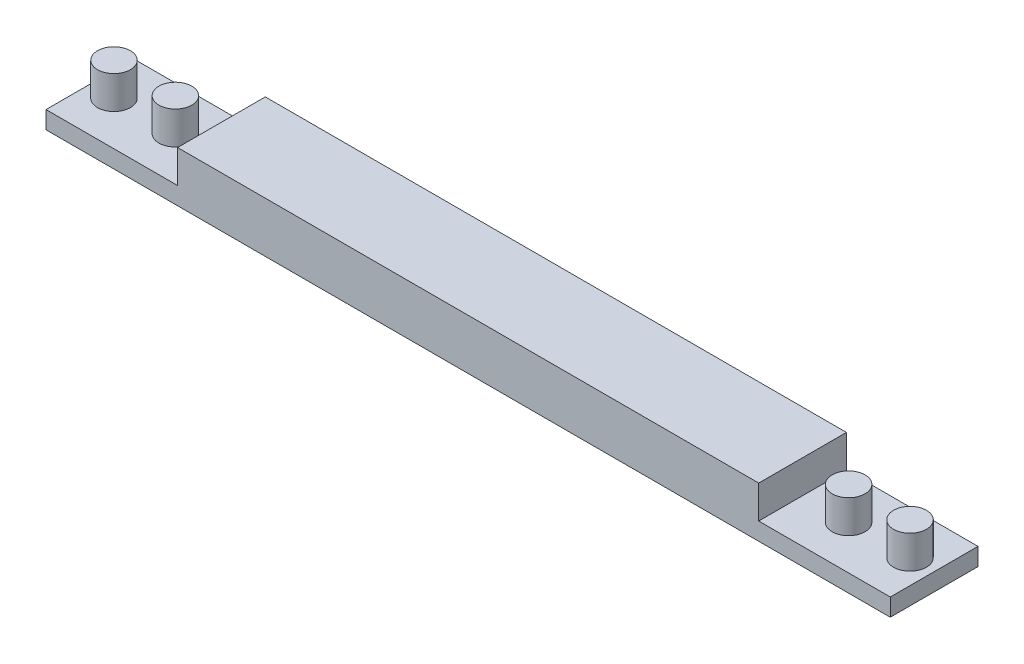
ISO-10303-21;
HEADER;
FILE_DESCRIPTION(('STEP AP214'),'2;1');
FILE_NAME('part.step','',(''),(''),'','','');
FILE_SCHEMA(('AUTOMOTIVE_DESIGN { 1 0 10303 214 1 1 1 1 }'));
ENDSEC;
DATA;
#1=APPLICATION_CONTEXT('core data for automotive mechanical design processes');
#2=APPLICATION_PROTOCOL_DEFINITION('international standard','automotive_design',2000,#1);
#3=PRODUCT_CONTEXT('',#1,'mechanical');
#4=PRODUCT('Part','Part','',(#3));
#5=PRODUCT_RELATED_PRODUCT_CATEGORY('part','',(#4));
#6=PRODUCT_DEFINITION_FORMATION('','',#4);
#7=PRODUCT_DEFINITION_CONTEXT('part definition',#1,'design');
#8=PRODUCT_DEFINITION('design','',#6,#7);
#9=PRODUCT_DEFINITION_SHAPE('','',#8);
#10=(LENGTH_UNIT() NAMED_UNIT(*) SI_UNIT(.MILLI.,.METRE.));
#11=(NAMED_UNIT(*) PLANE_ANGLE_UNIT() SI_UNIT($,.RADIAN.));
#12=(NAMED_UNIT(*) SI_UNIT($,.STERADIAN.) SOLID_ANGLE_UNIT());
#13=UNCERTAINTY_MEASURE_WITH_UNIT(LENGTH_MEASURE(1.E-05),#10,'distance_accuracy_value','');
#14=(GEOMETRIC_REPRESENTATION_CONTEXT(3) GLOBAL_UNCERTAINTY_ASSIGNED_CONTEXT((#13)) GLOBAL_UNIT_ASSIGNED_CONTEXT((#10,
#11,#12)) REPRESENTATION_CONTEXT('',''));
#15=CARTESIAN_POINT('',(0.,0.,0.));
#16=DIRECTION('',(0.,0.,1.));
#17=DIRECTION('',(1.,0.,0.));
#18=AXIS2_PLACEMENT_3D('',#15,#16,#17);
#19=CARTESIAN_POINT('',(0.,0.8,0.));
#20=DIRECTION('',(0.,1.,0.));
#21=DIRECTION('',(0.,0.,1.));
#22=AXIS2_PLACEMENT_3D('',#19,#20,#21);
#23=PLANE('',#22);
#24=CARTESIAN_POINT('',(15.35,0.8,0.));
#25=DIRECTION('',(0.,1.,0.));
#26=DIRECTION('',(0.,0.,-1.));
#27=AXIS2_PLACEMENT_3D('',#24,#25,#26);
#28=CIRCLE('',#27,0.750000000000002);
#29=CARTESIAN_POINT('',(15.35,0.8,-0.750000000000024));
#30=VERTEX_POINT('',#29);
#31=EDGE_CURVE('E203',#30,#30,#28,.T.);
#32=ORIENTED_EDGE('',*,*,#31,.F.);
#33=EDGE_LOOP('',(#32));
#34=FACE_BOUND('',#33,.T.);
#35=CARTESIAN_POINT('',(18.15,0.8,0.));
#36=DIRECTION('',(0.,1.,0.));
#37=DIRECTION('',(0.,0.,-1.));
#38=AXIS2_PLACEMENT_3D('',#35,#36,#37);
#39=CIRCLE('',#38,0.750000000000002);
#40=CARTESIAN_POINT('',(18.15,0.8,-0.750000000000005));
#41=VERTEX_POINT('',#40);
#42=EDGE_CURVE('E206',#41,#41,#39,.T.);
#43=ORIENTED_EDGE('',*,*,#42,.F.);
#44=EDGE_LOOP('',(#43));
#45=FACE_BOUND('',#44,.T.);
#46=DIRECTION('',(1.,0.,0.));
#47=VECTOR('',#46,1.);
#48=CARTESIAN_POINT('',(0.,0.8,-2.));
#49=LINE('',#48,#47);
#50=CARTESIAN_POINT('',(13.25,0.8,-2.));
#51=VERTEX_POINT('',#50);
#52=CARTESIAN_POINT('',(19.25,0.8,-2.));
#53=VERTEX_POINT('',#52);
#54=EDGE_CURVE('E150',#51,#53,#49,.T.);
#55=ORIENTED_EDGE('',*,*,#54,.F.);
#56=DIRECTION('',(0.,0.,1.));
#57=VECTOR('',#56,1.);
#58=CARTESIAN_POINT('',(13.25,0.8,0.));
#59=LINE('',#58,#57);
#60=CARTESIAN_POINT('',(13.25,0.8,2.));
#61=VERTEX_POINT('',#60);
#62=EDGE_CURVE('E122',#51,#61,#59,.T.);
#63=ORIENTED_EDGE('',*,*,#62,.T.);
#64=DIRECTION('',(1.,0.,0.));
#65=VECTOR('',#64,1.);
#66=CARTESIAN_POINT('',(0.,0.8,2.));
#67=LINE('',#66,#65);
#68=CARTESIAN_POINT('',(19.25,0.8,2.));
#69=VERTEX_POINT('',#68);
#70=EDGE_CURVE('E87',#61,#69,#67,.T.);
#71=ORIENTED_EDGE('',*,*,#70,.T.);
#72=DIRECTION('',(0.,0.,-1.));
#73=VECTOR('',#72,1.);
#74=CARTESIAN_POINT('',(19.25,0.8,0.));
#75=LINE('',#74,#73);
#76=EDGE_CURVE('E148',#69,#53,#75,.T.);
#77=ORIENTED_EDGE('',*,*,#76,.T.);
#78=EDGE_LOOP('',(#55,#63,#71,#77));
#79=FACE_BOUND('',#78,.T.);
#80=ADVANCED_FACE('F37',(#34,#45,#79),#23,.T.);
#81=CARTESIAN_POINT('',(0.,0.8,2.));
#82=DIRECTION('',(0.,0.,-1.));
#83=DIRECTION('',(-1.,0.,0.));
#84=AXIS2_PLACEMENT_3D('',#81,#82,#83);
#85=PLANE('',#84);
#86=DIRECTION('',(1.,0.,0.));
#87=VECTOR('',#86,1.);
#88=CARTESIAN_POINT('',(0.,0.,2.));
#89=LINE('',#88,#87);
#90=CARTESIAN_POINT('',(-19.25,0.,2.));
#91=VERTEX_POINT('',#90);
#92=CARTESIAN_POINT('',(19.25,0.,2.));
#93=VERTEX_POINT('',#92);
#94=EDGE_CURVE('E130',#91,#93,#89,.T.);
#95=ORIENTED_EDGE('',*,*,#94,.T.);
#96=DIRECTION('',(0.,-1.,0.));
#97=VECTOR('',#96,1.);
#98=CARTESIAN_POINT('',(19.25,0.8,2.));
#99=LINE('',#98,#97);
#100=EDGE_CURVE('E11',#69,#93,#99,.T.);
#101=ORIENTED_EDGE('',*,*,#100,.F.);
#102=ORIENTED_EDGE('',*,*,#70,.F.);
#103=DIRECTION('',(0.,-1.,0.));
#104=VECTOR('',#103,1.);
#105=CARTESIAN_POINT('',(13.25,2.3,2.));
#106=LINE('',#105,#104);
#107=CARTESIAN_POINT('',(13.25,2.3,2.));
#108=VERTEX_POINT('',#107);
#109=EDGE_CURVE('E52',#108,#61,#106,.T.);
#110=ORIENTED_EDGE('',*,*,#109,.F.);
#111=DIRECTION('',(-1.,0.,0.));
#112=VECTOR('',#111,1.);
#113=CARTESIAN_POINT('',(0.,2.3,2.));
#114=LINE('',#113,#112);
#115=CARTESIAN_POINT('',(-13.25,2.3,2.));
#116=VERTEX_POINT('',#115);
#117=EDGE_CURVE('E117',#108,#116,#114,.T.);
#118=ORIENTED_EDGE('',*,*,#117,.T.);
#119=DIRECTION('',(0.,-1.,0.));
#120=VECTOR('',#119,1.);
#121=CARTESIAN_POINT('',(-13.25,2.3,2.));
#122=LINE('',#121,#120);
#123=CARTESIAN_POINT('',(-13.25,0.8,2.));
#124=VERTEX_POINT('',#123);
#125=EDGE_CURVE('E125',#116,#124,#122,.T.);
#126=ORIENTED_EDGE('',*,*,#125,.T.);
#127=CARTESIAN_POINT('',(-19.25,0.8,2.));
#128=VERTEX_POINT('',#127);
#129=EDGE_CURVE('E146',#128,#124,#67,.T.);
#130=ORIENTED_EDGE('',*,*,#129,.F.);
#131=DIRECTION('',(0.,-1.,0.));
#132=VECTOR('',#131,1.);
#133=CARTESIAN_POINT('',(-19.25,0.8,2.));
#134=LINE('',#133,#132);
#135=EDGE_CURVE('E61',#128,#91,#134,.T.);
#136=ORIENTED_EDGE('',*,*,#135,.T.);
#137=EDGE_LOOP('',(#95,#101,#102,#110,#118,#126,#130,#136));
#138=FACE_BOUND('',#137,.T.);
#139=ADVANCED_FACE('F39',(#138),#85,.F.);
#140=CARTESIAN_POINT('',(19.25,0.8,0.));
#141=DIRECTION('',(-1.,0.,0.));
#142=DIRECTION('',(0.,0.,1.));
#143=AXIS2_PLACEMENT_3D('',#140,#141,#142);
#144=PLANE('',#143);
#145=DIRECTION('',(0.,0.,-1.));
#146=VECTOR('',#145,1.);
#147=CARTESIAN_POINT('',(19.25,0.,0.));
#148=LINE('',#147,#146);
#149=CARTESIAN_POINT('',(19.25,0.,-2.));
#150=VERTEX_POINT('',#149);
#151=EDGE_CURVE('E157',#93,#150,#148,.T.);
#152=ORIENTED_EDGE('',*,*,#151,.T.);
#153=DIRECTION('',(0.,-1.,0.));
#154=VECTOR('',#153,1.);
#155=CARTESIAN_POINT('',(19.25,0.8,-2.));
#156=LINE('',#155,#154);
#157=EDGE_CURVE('E45',#53,#150,#156,.T.);
#158=ORIENTED_EDGE('',*,*,#157,.F.);
#159=ORIENTED_EDGE('',*,*,#76,.F.);
#160=ORIENTED_EDGE('',*,*,#100,.T.);
#161=EDGE_LOOP('',(#152,#158,#159,#160));
#162=FACE_BOUND('',#161,.T.);
#163=ADVANCED_FACE('F174',(#162),#144,.F.);
#164=CARTESIAN_POINT('',(0.,0.8,-2.));
#165=DIRECTION('',(0.,0.,-1.));
#166=DIRECTION('',(-1.,0.,0.));
#167=AXIS2_PLACEMENT_3D('',#164,#165,#166);
#168=PLANE('',#167);
#169=DIRECTION('',(1.,0.,0.));
#170=VECTOR('',#169,1.);
#171=CARTESIAN_POINT('',(0.,0.,-2.));
#172=LINE('',#171,#170);
#173=CARTESIAN_POINT('',(-19.25,0.,-2.));
#174=VERTEX_POINT('',#173);
#175=EDGE_CURVE('E160',#174,#150,#172,.T.);
#176=ORIENTED_EDGE('',*,*,#175,.F.);
#177=DIRECTION('',(0.,-1.,0.));
#178=VECTOR('',#177,1.);
#179=CARTESIAN_POINT('',(-19.25,0.8,-2.));
#180=LINE('',#179,#178);
#181=CARTESIAN_POINT('',(-19.25,0.8,-2.));
#182=VERTEX_POINT('',#181);
#183=EDGE_CURVE('E167',#182,#174,#180,.T.);
#184=ORIENTED_EDGE('',*,*,#183,.F.);
#185=CARTESIAN_POINT('',(-13.25,0.8,-2.));
#186=VERTEX_POINT('',#185);
#187=EDGE_CURVE('E151',#182,#186,#49,.T.);
#188=ORIENTED_EDGE('',*,*,#187,.T.);
#189=DIRECTION('',(0.,-1.,0.));
#190=VECTOR('',#189,1.);
#191=CARTESIAN_POINT('',(-13.25,2.3,-2.));
#192=LINE('',#191,#190);
#193=CARTESIAN_POINT('',(-13.25,2.3,-2.));
#194=VERTEX_POINT('',#193);
#195=EDGE_CURVE('E138',#194,#186,#192,.T.);
#196=ORIENTED_EDGE('',*,*,#195,.F.);
#197=DIRECTION('',(-1.,0.,0.));
#198=VECTOR('',#197,1.);
#199=CARTESIAN_POINT('',(0.,2.3,-2.));
#200=LINE('',#199,#198);
#201=CARTESIAN_POINT('',(13.25,2.3,-2.));
#202=VERTEX_POINT('',#201);
#203=EDGE_CURVE('E119',#202,#194,#200,.T.);
#204=ORIENTED_EDGE('',*,*,#203,.F.);
#205=DIRECTION('',(0.,-1.,0.));
#206=VECTOR('',#205,1.);
#207=CARTESIAN_POINT('',(13.25,2.3,-2.));
#208=LINE('',#207,#206);
#209=EDGE_CURVE('E143',#202,#51,#208,.T.);
#210=ORIENTED_EDGE('',*,*,#209,.T.);
#211=ORIENTED_EDGE('',*,*,#54,.T.);
#212=ORIENTED_EDGE('',*,*,#157,.T.);
#213=EDGE_LOOP('',(#176,#184,#188,#196,#204,#210,#211,#212));
#214=FACE_BOUND('',#213,.T.);
#215=ADVANCED_FACE('F171',(#214),#168,.T.);
#216=CARTESIAN_POINT('',(-19.25,0.8,0.));
#217=DIRECTION('',(-1.,0.,0.));
#218=DIRECTION('',(0.,0.,1.));
#219=AXIS2_PLACEMENT_3D('',#216,#217,#218);
#220=PLANE('',#219);
#221=DIRECTION('',(0.,0.,-1.));
#222=VECTOR('',#221,1.);
#223=CARTESIAN_POINT('',(-19.25,0.,0.));
#224=LINE('',#223,#222);
#225=EDGE_CURVE('E163',#91,#174,#224,.T.);
#226=ORIENTED_EDGE('',*,*,#225,.F.);
#227=ORIENTED_EDGE('',*,*,#135,.F.);
#228=DIRECTION('',(0.,0.,-1.));
#229=VECTOR('',#228,1.);
#230=CARTESIAN_POINT('',(-19.25,0.8,0.));
#231=LINE('',#230,#229);
#232=EDGE_CURVE('E154',#128,#182,#231,.T.);
#233=ORIENTED_EDGE('',*,*,#232,.T.);
#234=ORIENTED_EDGE('',*,*,#183,.T.);
#235=EDGE_LOOP('',(#226,#227,#233,#234));
#236=FACE_BOUND('',#235,.T.);
#237=ADVANCED_FACE('F178',(#236),#220,.T.);
#238=CARTESIAN_POINT('',(-18.15,0.8,0.));
#239=DIRECTION('',(0.,1.,0.));
#240=DIRECTION('',(0.,0.,1.));
#241=AXIS2_PLACEMENT_3D('',#238,#239,#240);
#242=CIRCLE('',#241,0.750000000000002);
#243=CARTESIAN_POINT('',(-18.15,0.8,0.750000000000003));
#244=VERTEX_POINT('',#243);
#245=EDGE_CURVE('E258',#244,#244,#242,.T.);
#246=ORIENTED_EDGE('',*,*,#245,.F.);
#247=EDGE_LOOP('',(#246));
#248=FACE_BOUND('',#247,.T.);
#249=CARTESIAN_POINT('',(-15.35,0.8,0.));
#250=DIRECTION('',(0.,1.,0.));
#251=DIRECTION('',(0.,0.,1.));
#252=AXIS2_PLACEMENT_3D('',#249,#250,#251);
#253=CIRCLE('',#252,0.75);
#254=CARTESIAN_POINT('',(-15.35,0.8,0.749999999999982));
#255=VERTEX_POINT('',#254);
#256=EDGE_CURVE('E263',#255,#255,#253,.T.);
#257=ORIENTED_EDGE('',*,*,#256,.F.);
#258=EDGE_LOOP('',(#257));
#259=FACE_BOUND('',#258,.T.);
#260=DIRECTION('',(0.,0.,1.));
#261=VECTOR('',#260,1.);
#262=CARTESIAN_POINT('',(-13.25,0.8,0.));
#263=LINE('',#262,#261);
#264=EDGE_CURVE('E128',#186,#124,#263,.T.);
#265=ORIENTED_EDGE('',*,*,#264,.F.);
#266=ORIENTED_EDGE('',*,*,#187,.F.);
#267=ORIENTED_EDGE('',*,*,#232,.F.);
#268=ORIENTED_EDGE('',*,*,#129,.T.);
#269=EDGE_LOOP('',(#265,#266,#267,#268));
#270=FACE_BOUND('',#269,.T.);
#271=ADVANCED_FACE('F182',(#248,#259,#270),#23,.T.);
#272=CARTESIAN_POINT('',(0.,0.,0.));
#273=DIRECTION('',(0.,1.,0.));
#274=DIRECTION('',(0.,0.,1.));
#275=AXIS2_PLACEMENT_3D('',#272,#273,#274);
#276=PLANE('',#275);
#277=ORIENTED_EDGE('',*,*,#94,.F.);
#278=ORIENTED_EDGE('',*,*,#225,.T.);
#279=ORIENTED_EDGE('',*,*,#175,.T.);
#280=ORIENTED_EDGE('',*,*,#151,.F.);
#281=EDGE_LOOP('',(#277,#278,#279,#280));
#282=FACE_BOUND('',#281,.T.);
#283=ADVANCED_FACE('F177',(#282),#276,.F.);
#284=CARTESIAN_POINT('',(-13.25,2.3,0.));
#285=DIRECTION('',(1.,0.,0.));
#286=DIRECTION('',(0.,0.,-1.));
#287=AXIS2_PLACEMENT_3D('',#284,#285,#286);
#288=PLANE('',#287);
#289=ORIENTED_EDGE('',*,*,#264,.T.);
#290=ORIENTED_EDGE('',*,*,#125,.F.);
#291=DIRECTION('',(0.,0.,1.));
#292=VECTOR('',#291,1.);
#293=CARTESIAN_POINT('',(-13.25,2.3,0.));
#294=LINE('',#293,#292);
#295=EDGE_CURVE('E112',#194,#116,#294,.T.);
#296=ORIENTED_EDGE('',*,*,#295,.F.);
#297=ORIENTED_EDGE('',*,*,#195,.T.);
#298=EDGE_LOOP('',(#289,#290,#296,#297));
#299=FACE_BOUND('',#298,.T.);
#300=ADVANCED_FACE('F126',(#299),#288,.F.);
#301=CARTESIAN_POINT('',(13.25,2.3,0.));
#302=DIRECTION('',(1.,0.,0.));
#303=DIRECTION('',(0.,0.,-1.));
#304=AXIS2_PLACEMENT_3D('',#301,#302,#303);
#305=PLANE('',#304);
#306=ORIENTED_EDGE('',*,*,#62,.F.);
#307=ORIENTED_EDGE('',*,*,#209,.F.);
#308=DIRECTION('',(0.,0.,1.));
#309=VECTOR('',#308,1.);
#310=CARTESIAN_POINT('',(13.25,2.3,0.));
#311=LINE('',#310,#309);
#312=EDGE_CURVE('E132',#202,#108,#311,.T.);
#313=ORIENTED_EDGE('',*,*,#312,.T.);
#314=ORIENTED_EDGE('',*,*,#109,.T.);
#315=EDGE_LOOP('',(#306,#307,#313,#314));
#316=FACE_BOUND('',#315,.T.);
#317=ADVANCED_FACE('F207',(#316),#305,.T.);
#318=CARTESIAN_POINT('',(0.,2.3,0.));
#319=DIRECTION('',(0.,-1.,0.));
#320=DIRECTION('',(0.,0.,-1.));
#321=AXIS2_PLACEMENT_3D('',#318,#319,#320);
#322=PLANE('',#321);
#323=ORIENTED_EDGE('',*,*,#295,.T.);
#324=ORIENTED_EDGE('',*,*,#117,.F.);
#325=ORIENTED_EDGE('',*,*,#312,.F.);
#326=ORIENTED_EDGE('',*,*,#203,.T.);
#327=EDGE_LOOP('',(#323,#324,#325,#326));
#328=FACE_BOUND('',#327,.T.);
#329=ADVANCED_FACE('F114',(#328),#322,.F.);
#330=CARTESIAN_POINT('',(-15.35,2.3,0.));
#331=DIRECTION('',(0.,-1.,0.));
#332=DIRECTION('',(0.,0.,-1.));
#333=AXIS2_PLACEMENT_3D('',#330,#331,#332);
#334=CYLINDRICAL_SURFACE('',#333,0.75);
#335=CARTESIAN_POINT('',(-15.35,2.3,0.));
#336=DIRECTION('',(0.,1.,0.));
#337=DIRECTION('',(0.,0.,1.));
#338=AXIS2_PLACEMENT_3D('',#335,#336,#337);
#339=CIRCLE('',#338,0.75);
#340=CARTESIAN_POINT('',(-15.35,2.3,0.749999999999982));
#341=VERTEX_POINT('',#340);
#342=EDGE_CURVE('E140',#341,#341,#339,.T.);
#343=ORIENTED_EDGE('',*,*,#342,.F.);
#344=EDGE_LOOP('',(#343));
#345=FACE_BOUND('',#344,.T.);
#346=ORIENTED_EDGE('',*,*,#256,.T.);
#347=EDGE_LOOP('',(#346));
#348=FACE_BOUND('',#347,.T.);
#349=ADVANCED_FACE('F214',(#345,#348),#334,.T.);
#350=CARTESIAN_POINT('',(-15.35,2.3,0.));
#351=DIRECTION('',(0.,1.,0.));
#352=DIRECTION('',(0.,0.,1.));
#353=AXIS2_PLACEMENT_3D('',#350,#351,#352);
#354=PLANE('',#353);
#355=ORIENTED_EDGE('',*,*,#342,.T.);
#356=EDGE_LOOP('',(#355));
#357=FACE_BOUND('',#356,.T.);
#358=ADVANCED_FACE('F219',(#357),#354,.T.);
#359=CARTESIAN_POINT('',(-18.15,2.3,0.));
#360=DIRECTION('',(0.,-1.,0.));
#361=DIRECTION('',(0.,0.,-1.));
#362=AXIS2_PLACEMENT_3D('',#359,#360,#361);
#363=CYLINDRICAL_SURFACE('',#362,0.750000000000002);
#364=CARTESIAN_POINT('',(-18.15,2.3,0.));
#365=DIRECTION('',(0.,1.,0.));
#366=DIRECTION('',(0.,0.,1.));
#367=AXIS2_PLACEMENT_3D('',#364,#365,#366);
#368=CIRCLE('',#367,0.750000000000002);
#369=CARTESIAN_POINT('',(-18.15,2.3,0.750000000000003));
#370=VERTEX_POINT('',#369);
#371=EDGE_CURVE('E260',#370,#370,#368,.T.);
#372=ORIENTED_EDGE('',*,*,#371,.F.);
#373=EDGE_LOOP('',(#372));
#374=FACE_BOUND('',#373,.T.);
#375=ORIENTED_EDGE('',*,*,#245,.T.);
#376=EDGE_LOOP('',(#375));
#377=FACE_BOUND('',#376,.T.);
#378=ADVANCED_FACE('F223',(#374,#377),#363,.T.);
#379=CARTESIAN_POINT('',(-18.15,2.3,0.));
#380=DIRECTION('',(0.,1.,0.));
#381=DIRECTION('',(0.,0.,1.));
#382=AXIS2_PLACEMENT_3D('',#379,#380,#381);
#383=PLANE('',#382);
#384=ORIENTED_EDGE('',*,*,#371,.T.);
#385=EDGE_LOOP('',(#384));
#386=FACE_BOUND('',#385,.T.);
#387=ADVANCED_FACE('F227',(#386),#383,.T.);
#388=CARTESIAN_POINT('',(18.15,2.3,0.));
#389=DIRECTION('',(0.,-1.,0.));
#390=DIRECTION('',(0.,0.,-1.));
#391=AXIS2_PLACEMENT_3D('',#388,#389,#390);
#392=CYLINDRICAL_SURFACE('',#391,0.750000000000002);
#393=CARTESIAN_POINT('',(18.15,2.3,0.));
#394=DIRECTION('',(0.,1.,0.));
#395=DIRECTION('',(0.,0.,-1.));
#396=AXIS2_PLACEMENT_3D('',#393,#394,#395);
#397=CIRCLE('',#396,0.750000000000002);
#398=CARTESIAN_POINT('',(18.15,2.3,-0.750000000000005));
#399=VERTEX_POINT('',#398);
#400=EDGE_CURVE('E253',#399,#399,#397,.T.);
#401=ORIENTED_EDGE('',*,*,#400,.F.);
#402=EDGE_LOOP('',(#401));
#403=FACE_BOUND('',#402,.T.);
#404=ORIENTED_EDGE('',*,*,#42,.T.);
#405=EDGE_LOOP('',(#404));
#406=FACE_BOUND('',#405,.T.);
#407=ADVANCED_FACE('F231',(#403,#406),#392,.T.);
#408=CARTESIAN_POINT('',(18.15,2.3,0.));
#409=DIRECTION('',(0.,-1.,0.));
#410=DIRECTION('',(0.,0.,-1.));
#411=AXIS2_PLACEMENT_3D('',#408,#409,#410);
#412=PLANE('',#411);
#413=ORIENTED_EDGE('',*,*,#400,.T.);
#414=EDGE_LOOP('',(#413));
#415=FACE_BOUND('',#414,.T.);
#416=ADVANCED_FACE('F235',(#415),#412,.F.);
#417=CARTESIAN_POINT('',(15.35,2.3,0.));
#418=DIRECTION('',(0.,-1.,0.));
#419=DIRECTION('',(0.,0.,-1.));
#420=AXIS2_PLACEMENT_3D('',#417,#418,#419);
#421=CYLINDRICAL_SURFACE('',#420,0.750000000000002);
#422=CARTESIAN_POINT('',(15.35,2.3,0.));
#423=DIRECTION('',(0.,1.,0.));
#424=DIRECTION('',(0.,0.,-1.));
#425=AXIS2_PLACEMENT_3D('',#422,#423,#424);
#426=CIRCLE('',#425,0.750000000000002);
#427=CARTESIAN_POINT('',(15.35,2.3,-0.750000000000024));
#428=VERTEX_POINT('',#427);
#429=EDGE_CURVE('E251',#428,#428,#426,.T.);
#430=ORIENTED_EDGE('',*,*,#429,.F.);
#431=EDGE_LOOP('',(#430));
#432=FACE_BOUND('',#431,.T.);
#433=ORIENTED_EDGE('',*,*,#31,.T.);
#434=EDGE_LOOP('',(#433));
#435=FACE_BOUND('',#434,.T.);
#436=ADVANCED_FACE('F239',(#432,#435),#421,.T.);
#437=CARTESIAN_POINT('',(15.35,2.3,0.));
#438=DIRECTION('',(0.,-1.,0.));
#439=DIRECTION('',(0.,0.,-1.));
#440=AXIS2_PLACEMENT_3D('',#437,#438,#439);
#441=PLANE('',#440);
#442=ORIENTED_EDGE('',*,*,#429,.T.);
#443=EDGE_LOOP('',(#442));
#444=FACE_BOUND('',#443,.T.);
#445=ADVANCED_FACE('F243',(#444),#441,.F.);
#446=CLOSED_SHELL('',(#80,#139,#163,#215,#237,#271,#283,#300,#317,#329,#349,#358,#378,#387,#407,
#416,#436,#445));
#447=MANIFOLD_SOLID_BREP('B2',#446);
#448=ADVANCED_BREP_SHAPE_REPRESENTATION('',(#18,#447),#14);
#449=SHAPE_DEFINITION_REPRESENTATION(#9,#448);
ENDSEC;
END-ISO-10303-21;
